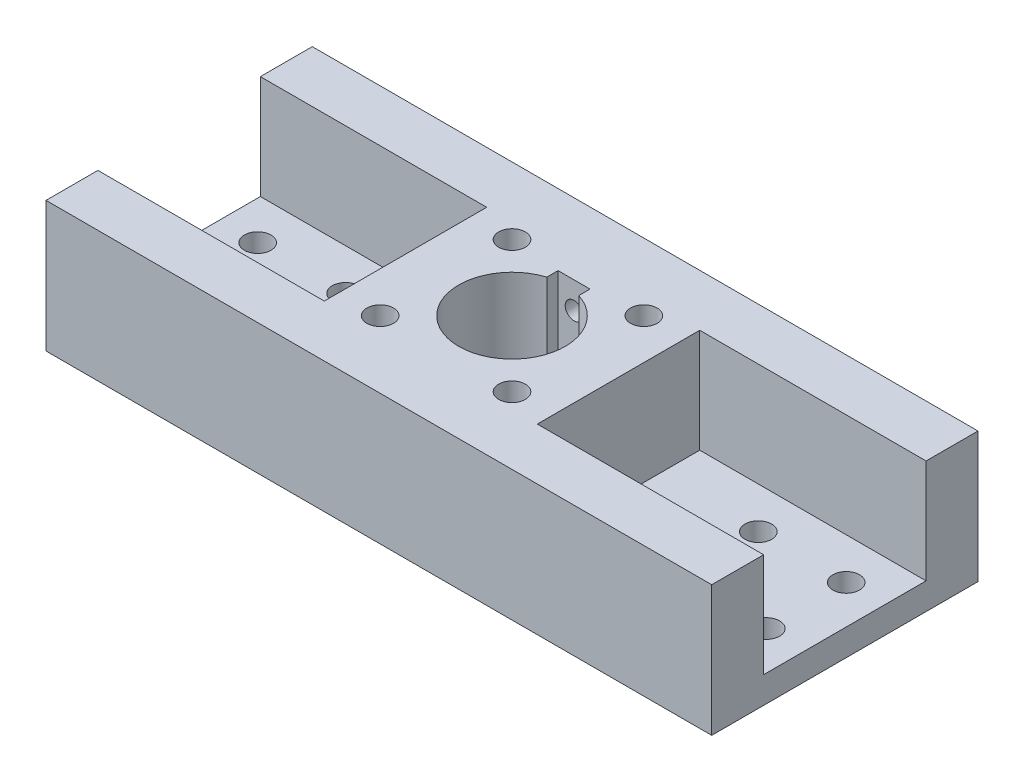
ISO-10303-21;
HEADER;
FILE_DESCRIPTION(('STEP AP214'),'2;1');
FILE_NAME('part.step','',(''),(''),'','','');
FILE_SCHEMA(('AUTOMOTIVE_DESIGN { 1 0 10303 214 1 1 1 1 }'));
ENDSEC;
DATA;
#1=APPLICATION_CONTEXT('core data for automotive mechanical design processes');
#2=APPLICATION_PROTOCOL_DEFINITION('international standard','automotive_design',2000,#1);
#3=PRODUCT_CONTEXT('',#1,'mechanical');
#4=PRODUCT('Part','Part','',(#3));
#5=PRODUCT_RELATED_PRODUCT_CATEGORY('part','',(#4));
#6=PRODUCT_DEFINITION_FORMATION('','',#4);
#7=PRODUCT_DEFINITION_CONTEXT('part definition',#1,'design');
#8=PRODUCT_DEFINITION('design','',#6,#7);
#9=PRODUCT_DEFINITION_SHAPE('','',#8);
#10=(LENGTH_UNIT() NAMED_UNIT(*) SI_UNIT(.MILLI.,.METRE.));
#11=(NAMED_UNIT(*) PLANE_ANGLE_UNIT() SI_UNIT($,.RADIAN.));
#12=(NAMED_UNIT(*) SI_UNIT($,.STERADIAN.) SOLID_ANGLE_UNIT());
#13=UNCERTAINTY_MEASURE_WITH_UNIT(LENGTH_MEASURE(1.E-05),#10,'distance_accuracy_value','');
#14=(GEOMETRIC_REPRESENTATION_CONTEXT(3) GLOBAL_UNCERTAINTY_ASSIGNED_CONTEXT((#13)) GLOBAL_UNIT_ASSIGNED_CONTEXT((#10,
#11,#12)) REPRESENTATION_CONTEXT('',''));
#15=CARTESIAN_POINT('',(0.,0.,0.));
#16=DIRECTION('',(0.,0.,1.));
#17=DIRECTION('',(1.,0.,0.));
#18=AXIS2_PLACEMENT_3D('',#15,#16,#17);
#19=CARTESIAN_POINT('',(0.,-14.5,223.68047062222));
#20=DIRECTION('',(0.,0.,-1.));
#21=DIRECTION('',(-1.,0.,0.));
#22=AXIS2_PLACEMENT_3D('',#19,#20,#21);
#23=CYLINDRICAL_SURFACE('',#22,3.3235);
#24=CARTESIAN_POINT('',(0.,-14.5,-50.));
#25=DIRECTION('',(0.,0.,-1.));
#26=DIRECTION('',(-1.,0.,0.));
#27=AXIS2_PLACEMENT_3D('',#24,#25,#26);
#28=CIRCLE('',#27,3.3235);
#29=CARTESIAN_POINT('',(-3.3235,-14.5,-50.));
#30=VERTEX_POINT('',#29);
#31=EDGE_CURVE('E162',#30,#30,#28,.T.);
#32=ORIENTED_EDGE('',*,*,#31,.T.);
#33=EDGE_LOOP('',(#32));
#34=FACE_BOUND('',#33,.T.);
#35=CARTESIAN_POINT('',(0.,-14.5,-23.3));
#36=DIRECTION('',(0.,0.,-1.));
#37=DIRECTION('',(-1.,0.,0.));
#38=AXIS2_PLACEMENT_3D('',#35,#36,#37);
#39=CIRCLE('',#38,3.3235);
#40=CARTESIAN_POINT('',(-3.3235,-14.5,-23.3));
#41=VERTEX_POINT('',#40);
#42=EDGE_CURVE('E291',#41,#41,#39,.T.);
#43=ORIENTED_EDGE('',*,*,#42,.F.);
#44=EDGE_LOOP('',(#43));
#45=FACE_BOUND('',#44,.T.);
#46=ADVANCED_FACE('F17',(#34,#45),#23,.F.);
#47=CARTESIAN_POINT('',(0.,14.5,223.68047062222));
#48=DIRECTION('',(0.,0.,-1.));
#49=DIRECTION('',(-1.,0.,0.));
#50=AXIS2_PLACEMENT_3D('',#47,#48,#49);
#51=CYLINDRICAL_SURFACE('',#50,3.3235);
#52=CARTESIAN_POINT('',(0.,14.5,-50.));
#53=DIRECTION('',(0.,0.,-1.));
#54=DIRECTION('',(-1.,0.,0.));
#55=AXIS2_PLACEMENT_3D('',#52,#53,#54);
#56=CIRCLE('',#55,3.3235);
#57=CARTESIAN_POINT('',(-3.3235,14.5,-50.));
#58=VERTEX_POINT('',#57);
#59=EDGE_CURVE('E166',#58,#58,#56,.T.);
#60=ORIENTED_EDGE('',*,*,#59,.T.);
#61=EDGE_LOOP('',(#60));
#62=FACE_BOUND('',#61,.T.);
#63=CARTESIAN_POINT('',(0.,14.5,-23.3));
#64=DIRECTION('',(0.,0.,-1.));
#65=DIRECTION('',(-1.,0.,0.));
#66=AXIS2_PLACEMENT_3D('',#63,#64,#65);
#67=CIRCLE('',#66,3.3235);
#68=CARTESIAN_POINT('',(-3.3235,14.5,-23.3));
#69=VERTEX_POINT('',#68);
#70=EDGE_CURVE('E25',#69,#69,#67,.T.);
#71=ORIENTED_EDGE('',*,*,#70,.F.);
#72=EDGE_LOOP('',(#71));
#73=FACE_BOUND('',#72,.T.);
#74=ADVANCED_FACE('F302',(#62,#73),#51,.F.);
#75=CARTESIAN_POINT('',(-6.,-249.18047062222,-23.3));
#76=DIRECTION('',(-1.,0.,0.));
#77=DIRECTION('',(0.,1.,0.));
#78=AXIS2_PLACEMENT_3D('',#75,#76,#77);
#79=PLANE('',#78);
#80=DIRECTION('',(0.,1.,0.));
#81=VECTOR('',#80,1.);
#82=CARTESIAN_POINT('',(-6.,-249.18047062222,-23.3));
#83=LINE('',#82,#81);
#84=CARTESIAN_POINT('',(-6.,-24.5,-23.3));
#85=VERTEX_POINT('',#84);
#86=CARTESIAN_POINT('',(-6.,24.5,-23.3));
#87=VERTEX_POINT('',#86);
#88=EDGE_CURVE('E11',#85,#87,#83,.T.);
#89=ORIENTED_EDGE('',*,*,#88,.T.);
#90=DIRECTION('',(0.,0.,1.));
#91=VECTOR('',#90,1.);
#92=CARTESIAN_POINT('',(-6.,24.5,-23.3));
#93=LINE('',#92,#91);
#94=CARTESIAN_POINT('',(-6.,24.5,-19.0787840283389));
#95=VERTEX_POINT('',#94);
#96=EDGE_CURVE('E540',#87,#95,#93,.T.);
#97=ORIENTED_EDGE('',*,*,#96,.T.);
#98=DIRECTION('',(0.,-1.,0.));
#99=VECTOR('',#98,1.);
#100=CARTESIAN_POINT('',(-6.,-47.5,-19.0787840283389));
#101=LINE('',#100,#99);
#102=CARTESIAN_POINT('',(-6.,-24.5,-19.0787840283389));
#103=VERTEX_POINT('',#102);
#104=EDGE_CURVE('E167',#95,#103,#101,.T.);
#105=ORIENTED_EDGE('',*,*,#104,.T.);
#106=DIRECTION('',(0.,0.,1.));
#107=VECTOR('',#106,1.);
#108=CARTESIAN_POINT('',(-6.,-24.5,0.));
#109=LINE('',#108,#107);
#110=EDGE_CURVE('E236',#85,#103,#109,.T.);
#111=ORIENTED_EDGE('',*,*,#110,.F.);
#112=EDGE_LOOP('',(#89,#97,#105,#111));
#113=FACE_BOUND('',#112,.T.);
#114=ADVANCED_FACE('F304',(#113),#79,.F.);
#115=CARTESIAN_POINT('',(6.,-249.18047062222,-23.3));
#116=DIRECTION('',(0.,0.,-1.));
#117=DIRECTION('',(0.,-1.,0.));
#118=AXIS2_PLACEMENT_3D('',#115,#116,#117);
#119=PLANE('',#118);
#120=DIRECTION('',(0.,1.,0.));
#121=VECTOR('',#120,1.);
#122=CARTESIAN_POINT('',(6.,-249.18047062222,-23.3));
#123=LINE('',#122,#121);
#124=CARTESIAN_POINT('',(6.,-24.5,-23.3));
#125=VERTEX_POINT('',#124);
#126=CARTESIAN_POINT('',(6.,24.5,-23.3));
#127=VERTEX_POINT('',#126);
#128=EDGE_CURVE('E171',#125,#127,#123,.T.);
#129=ORIENTED_EDGE('',*,*,#128,.T.);
#130=DIRECTION('',(-1.,0.,0.));
#131=VECTOR('',#130,1.);
#132=CARTESIAN_POINT('',(6.,24.5,-23.3));
#133=LINE('',#132,#131);
#134=EDGE_CURVE('E460',#127,#87,#133,.T.);
#135=ORIENTED_EDGE('',*,*,#134,.T.);
#136=ORIENTED_EDGE('',*,*,#88,.F.);
#137=DIRECTION('',(-1.,0.,0.));
#138=VECTOR('',#137,1.);
#139=CARTESIAN_POINT('',(0.,-24.5,-23.3));
#140=LINE('',#139,#138);
#141=EDGE_CURVE('E235',#125,#85,#140,.T.);
#142=ORIENTED_EDGE('',*,*,#141,.F.);
#143=EDGE_LOOP('',(#129,#135,#136,#142));
#144=FACE_BOUND('',#143,.T.);
#145=ORIENTED_EDGE('',*,*,#70,.T.);
#146=EDGE_LOOP('',(#145));
#147=FACE_BOUND('',#146,.T.);
#148=ORIENTED_EDGE('',*,*,#42,.T.);
#149=EDGE_LOOP('',(#148));
#150=FACE_BOUND('',#149,.T.);
#151=ADVANCED_FACE('F299',(#144,#147,#150),#119,.F.);
#152=CARTESIAN_POINT('',(6.,-249.18047062222,-18.3));
#153=DIRECTION('',(1.,0.,0.));
#154=DIRECTION('',(0.,1.,0.));
#155=AXIS2_PLACEMENT_3D('',#152,#153,#154);
#156=PLANE('',#155);
#157=DIRECTION('',(0.,1.,0.));
#158=VECTOR('',#157,1.);
#159=CARTESIAN_POINT('',(6.,-47.5,-19.0787840283389));
#160=LINE('',#159,#158);
#161=CARTESIAN_POINT('',(6.,-24.5,-19.0787840283389));
#162=VERTEX_POINT('',#161);
#163=CARTESIAN_POINT('',(6.,24.5,-19.0787840283389));
#164=VERTEX_POINT('',#163);
#165=EDGE_CURVE('E172',#162,#164,#160,.T.);
#166=ORIENTED_EDGE('',*,*,#165,.T.);
#167=DIRECTION('',(0.,0.,-1.));
#168=VECTOR('',#167,1.);
#169=CARTESIAN_POINT('',(6.,24.5,-18.3));
#170=LINE('',#169,#168);
#171=EDGE_CURVE('E530',#164,#127,#170,.T.);
#172=ORIENTED_EDGE('',*,*,#171,.T.);
#173=ORIENTED_EDGE('',*,*,#128,.F.);
#174=DIRECTION('',(0.,0.,-1.));
#175=VECTOR('',#174,1.);
#176=CARTESIAN_POINT('',(6.,-24.5,0.));
#177=LINE('',#176,#175);
#178=EDGE_CURVE('E231',#162,#125,#177,.T.);
#179=ORIENTED_EDGE('',*,*,#178,.F.);
#180=EDGE_LOOP('',(#166,#172,#173,#179));
#181=FACE_BOUND('',#180,.T.);
#182=ADVANCED_FACE('F317',(#181),#156,.F.);
#183=CARTESIAN_POINT('',(-57.5,-144.,0.));
#184=DIRECTION('',(0.,1.,0.));
#185=DIRECTION('',(0.,0.,1.));
#186=AXIS2_PLACEMENT_3D('',#183,#184,#185);
#187=CYLINDRICAL_SURFACE('',#186,5.);
#188=CARTESIAN_POINT('',(-57.5,-24.5,0.));
#189=DIRECTION('',(0.,1.,0.));
#190=DIRECTION('',(0.,0.,1.));
#191=AXIS2_PLACEMENT_3D('',#188,#189,#190);
#192=CIRCLE('',#191,5.);
#193=CARTESIAN_POINT('',(-57.5,-24.5,5.00000000000001));
#194=VERTEX_POINT('',#193);
#195=EDGE_CURVE('E132',#194,#194,#192,.T.);
#196=ORIENTED_EDGE('',*,*,#195,.F.);
#197=EDGE_LOOP('',(#196));
#198=FACE_BOUND('',#197,.T.);
#199=CARTESIAN_POINT('',(-57.5,-14.5,0.));
#200=DIRECTION('',(0.,-1.,0.));
#201=DIRECTION('',(0.,0.,-1.));
#202=AXIS2_PLACEMENT_3D('',#199,#200,#201);
#203=CIRCLE('',#202,5.);
#204=CARTESIAN_POINT('',(-57.5,-14.5,-4.99999999999999));
#205=VERTEX_POINT('',#204);
#206=EDGE_CURVE('E240',#205,#205,#203,.T.);
#207=ORIENTED_EDGE('',*,*,#206,.F.);
#208=EDGE_LOOP('',(#207));
#209=FACE_BOUND('',#208,.T.);
#210=ADVANCED_FACE('F319',(#198,#209),#187,.F.);
#211=CARTESIAN_POINT('',(-77.5,-144.,-15.));
#212=DIRECTION('',(0.,1.,0.));
#213=DIRECTION('',(0.,0.,1.));
#214=AXIS2_PLACEMENT_3D('',#211,#212,#213);
#215=CYLINDRICAL_SURFACE('',#214,5.);
#216=CARTESIAN_POINT('',(-77.5,-24.5,-15.));
#217=DIRECTION('',(0.,1.,0.));
#218=DIRECTION('',(0.,0.,1.));
#219=AXIS2_PLACEMENT_3D('',#216,#217,#218);
#220=CIRCLE('',#219,5.);
#221=CARTESIAN_POINT('',(-77.5,-24.5,-10.));
#222=VERTEX_POINT('',#221);
#223=EDGE_CURVE('E200',#222,#222,#220,.T.);
#224=ORIENTED_EDGE('',*,*,#223,.F.);
#225=EDGE_LOOP('',(#224));
#226=FACE_BOUND('',#225,.T.);
#227=CARTESIAN_POINT('',(-77.5,-14.5,-15.));
#228=DIRECTION('',(0.,-1.,0.));
#229=DIRECTION('',(0.,0.,-1.));
#230=AXIS2_PLACEMENT_3D('',#227,#228,#229);
#231=CIRCLE('',#230,5.);
#232=CARTESIAN_POINT('',(-77.5,-14.5,-20.));
#233=VERTEX_POINT('',#232);
#234=EDGE_CURVE('E250',#233,#233,#231,.T.);
#235=ORIENTED_EDGE('',*,*,#234,.F.);
#236=EDGE_LOOP('',(#235));
#237=FACE_BOUND('',#236,.T.);
#238=ADVANCED_FACE('F322',(#226,#237),#215,.F.);
#239=CARTESIAN_POINT('',(-110.5,-144.,-15.));
#240=DIRECTION('',(0.,1.,0.));
#241=DIRECTION('',(0.,0.,1.));
#242=AXIS2_PLACEMENT_3D('',#239,#240,#241);
#243=CYLINDRICAL_SURFACE('',#242,5.);
#244=CARTESIAN_POINT('',(-110.5,-24.5,-15.));
#245=DIRECTION('',(0.,1.,0.));
#246=DIRECTION('',(0.,0.,1.));
#247=AXIS2_PLACEMENT_3D('',#244,#245,#246);
#248=CIRCLE('',#247,5.);
#249=CARTESIAN_POINT('',(-110.5,-24.5,-10.));
#250=VERTEX_POINT('',#249);
#251=EDGE_CURVE('E204',#250,#250,#248,.T.);
#252=ORIENTED_EDGE('',*,*,#251,.F.);
#253=EDGE_LOOP('',(#252));
#254=FACE_BOUND('',#253,.T.);
#255=CARTESIAN_POINT('',(-110.5,-14.5,-15.));
#256=DIRECTION('',(0.,-1.,0.));
#257=DIRECTION('',(0.,0.,-1.));
#258=AXIS2_PLACEMENT_3D('',#255,#256,#257);
#259=CIRCLE('',#258,5.);
#260=CARTESIAN_POINT('',(-110.5,-14.5,-20.));
#261=VERTEX_POINT('',#260);
#262=EDGE_CURVE('E254',#261,#261,#259,.T.);
#263=ORIENTED_EDGE('',*,*,#262,.F.);
#264=EDGE_LOOP('',(#263));
#265=FACE_BOUND('',#264,.T.);
#266=ADVANCED_FACE('F326',(#254,#265),#243,.F.);
#267=CARTESIAN_POINT('',(-77.5,-144.,15.));
#268=DIRECTION('',(0.,1.,0.));
#269=DIRECTION('',(0.,0.,1.));
#270=AXIS2_PLACEMENT_3D('',#267,#268,#269);
#271=CYLINDRICAL_SURFACE('',#270,5.);
#272=CARTESIAN_POINT('',(-77.5,-24.5,15.));
#273=DIRECTION('',(0.,1.,0.));
#274=DIRECTION('',(0.,0.,1.));
#275=AXIS2_PLACEMENT_3D('',#272,#273,#274);
#276=CIRCLE('',#275,5.);
#277=CARTESIAN_POINT('',(-77.5,-24.5,20.));
#278=VERTEX_POINT('',#277);
#279=EDGE_CURVE('E209',#278,#278,#276,.T.);
#280=ORIENTED_EDGE('',*,*,#279,.F.);
#281=EDGE_LOOP('',(#280));
#282=FACE_BOUND('',#281,.T.);
#283=CARTESIAN_POINT('',(-77.5,-14.5,15.));
#284=DIRECTION('',(0.,-1.,0.));
#285=DIRECTION('',(0.,0.,-1.));
#286=AXIS2_PLACEMENT_3D('',#283,#284,#285);
#287=CIRCLE('',#286,5.);
#288=CARTESIAN_POINT('',(-77.5,-14.5,10.));
#289=VERTEX_POINT('',#288);
#290=EDGE_CURVE('E116',#289,#289,#287,.T.);
#291=ORIENTED_EDGE('',*,*,#290,.F.);
#292=EDGE_LOOP('',(#291));
#293=FACE_BOUND('',#292,.T.);
#294=ADVANCED_FACE('F330',(#282,#293),#271,.F.);
#295=CARTESIAN_POINT('',(-110.5,-144.,15.));
#296=DIRECTION('',(0.,1.,0.));
#297=DIRECTION('',(0.,0.,1.));
#298=AXIS2_PLACEMENT_3D('',#295,#296,#297);
#299=CYLINDRICAL_SURFACE('',#298,5.);
#300=CARTESIAN_POINT('',(-110.5,-24.5,15.));
#301=DIRECTION('',(0.,1.,0.));
#302=DIRECTION('',(0.,0.,1.));
#303=AXIS2_PLACEMENT_3D('',#300,#301,#302);
#304=CIRCLE('',#303,5.);
#305=CARTESIAN_POINT('',(-110.5,-24.5,20.));
#306=VERTEX_POINT('',#305);
#307=EDGE_CURVE('E213',#306,#306,#304,.T.);
#308=ORIENTED_EDGE('',*,*,#307,.F.);
#309=EDGE_LOOP('',(#308));
#310=FACE_BOUND('',#309,.T.);
#311=CARTESIAN_POINT('',(-110.5,-14.5,15.));
#312=DIRECTION('',(0.,-1.,0.));
#313=DIRECTION('',(0.,0.,-1.));
#314=AXIS2_PLACEMENT_3D('',#311,#312,#313);
#315=CIRCLE('',#314,5.);
#316=CARTESIAN_POINT('',(-110.5,-14.5,10.));
#317=VERTEX_POINT('',#316);
#318=EDGE_CURVE('E109',#317,#317,#315,.T.);
#319=ORIENTED_EDGE('',*,*,#318,.F.);
#320=EDGE_LOOP('',(#319));
#321=FACE_BOUND('',#320,.T.);
#322=ADVANCED_FACE('F334',(#310,#321),#299,.F.);
#323=CARTESIAN_POINT('',(77.5,-144.,15.));
#324=DIRECTION('',(0.,1.,0.));
#325=DIRECTION('',(0.,0.,1.));
#326=AXIS2_PLACEMENT_3D('',#323,#324,#325);
#327=CYLINDRICAL_SURFACE('',#326,5.);
#328=CARTESIAN_POINT('',(77.5,-24.5,15.));
#329=DIRECTION('',(0.,1.,0.));
#330=DIRECTION('',(0.,0.,1.));
#331=AXIS2_PLACEMENT_3D('',#328,#329,#330);
#332=CIRCLE('',#331,5.);
#333=CARTESIAN_POINT('',(77.5,-24.5,20.));
#334=VERTEX_POINT('',#333);
#335=EDGE_CURVE('E127',#334,#334,#332,.T.);
#336=ORIENTED_EDGE('',*,*,#335,.F.);
#337=EDGE_LOOP('',(#336));
#338=FACE_BOUND('',#337,.T.);
#339=CARTESIAN_POINT('',(77.5,-14.5,15.));
#340=DIRECTION('',(0.,-1.,0.));
#341=DIRECTION('',(0.,0.,-1.));
#342=AXIS2_PLACEMENT_3D('',#339,#340,#341);
#343=CIRCLE('',#342,5.);
#344=CARTESIAN_POINT('',(77.5,-14.5,10.));
#345=VERTEX_POINT('',#344);
#346=EDGE_CURVE('E177',#345,#345,#343,.T.);
#347=ORIENTED_EDGE('',*,*,#346,.F.);
#348=EDGE_LOOP('',(#347));
#349=FACE_BOUND('',#348,.T.);
#350=ADVANCED_FACE('F338',(#338,#349),#327,.F.);
#351=CARTESIAN_POINT('',(110.5,-144.,15.));
#352=DIRECTION('',(0.,1.,0.));
#353=DIRECTION('',(0.,0.,1.));
#354=AXIS2_PLACEMENT_3D('',#351,#352,#353);
#355=CYLINDRICAL_SURFACE('',#354,5.);
#356=CARTESIAN_POINT('',(110.5,-24.5,15.));
#357=DIRECTION('',(0.,1.,0.));
#358=DIRECTION('',(0.,0.,1.));
#359=AXIS2_PLACEMENT_3D('',#356,#357,#358);
#360=CIRCLE('',#359,5.);
#361=CARTESIAN_POINT('',(110.5,-24.5,20.));
#362=VERTEX_POINT('',#361);
#363=EDGE_CURVE('E131',#362,#362,#360,.T.);
#364=ORIENTED_EDGE('',*,*,#363,.F.);
#365=EDGE_LOOP('',(#364));
#366=FACE_BOUND('',#365,.T.);
#367=CARTESIAN_POINT('',(110.5,-14.5,15.));
#368=DIRECTION('',(0.,-1.,0.));
#369=DIRECTION('',(0.,0.,-1.));
#370=AXIS2_PLACEMENT_3D('',#367,#368,#369);
#371=CIRCLE('',#370,5.);
#372=CARTESIAN_POINT('',(110.5,-14.5,10.));
#373=VERTEX_POINT('',#372);
#374=EDGE_CURVE('E181',#373,#373,#371,.T.);
#375=ORIENTED_EDGE('',*,*,#374,.F.);
#376=EDGE_LOOP('',(#375));
#377=FACE_BOUND('',#376,.T.);
#378=ADVANCED_FACE('F340',(#366,#377),#355,.F.);
#379=CARTESIAN_POINT('',(57.5,-144.,0.));
#380=DIRECTION('',(0.,1.,0.));
#381=DIRECTION('',(0.,0.,1.));
#382=AXIS2_PLACEMENT_3D('',#379,#380,#381);
#383=CYLINDRICAL_SURFACE('',#382,5.);
#384=CARTESIAN_POINT('',(57.5,-24.5,0.));
#385=DIRECTION('',(0.,1.,0.));
#386=DIRECTION('',(0.,0.,1.));
#387=AXIS2_PLACEMENT_3D('',#384,#385,#386);
#388=CIRCLE('',#387,5.);
#389=CARTESIAN_POINT('',(57.5,-24.5,5.00000000000001));
#390=VERTEX_POINT('',#389);
#391=EDGE_CURVE('E195',#390,#390,#388,.T.);
#392=ORIENTED_EDGE('',*,*,#391,.F.);
#393=EDGE_LOOP('',(#392));
#394=FACE_BOUND('',#393,.T.);
#395=CARTESIAN_POINT('',(57.5,-14.5,0.));
#396=DIRECTION('',(0.,-1.,0.));
#397=DIRECTION('',(0.,0.,-1.));
#398=AXIS2_PLACEMENT_3D('',#395,#396,#397);
#399=CIRCLE('',#398,5.);
#400=CARTESIAN_POINT('',(57.5,-14.5,-4.99999999999999));
#401=VERTEX_POINT('',#400);
#402=EDGE_CURVE('E268',#401,#401,#399,.T.);
#403=ORIENTED_EDGE('',*,*,#402,.F.);
#404=EDGE_LOOP('',(#403));
#405=FACE_BOUND('',#404,.T.);
#406=ADVANCED_FACE('F343',(#394,#405),#383,.F.);
#407=CARTESIAN_POINT('',(110.5,-144.,-15.));
#408=DIRECTION('',(0.,1.,0.));
#409=DIRECTION('',(0.,0.,1.));
#410=AXIS2_PLACEMENT_3D('',#407,#408,#409);
#411=CYLINDRICAL_SURFACE('',#410,5.);
#412=CARTESIAN_POINT('',(110.5,-24.5,-15.));
#413=DIRECTION('',(0.,1.,0.));
#414=DIRECTION('',(0.,0.,1.));
#415=AXIS2_PLACEMENT_3D('',#412,#413,#414);
#416=CIRCLE('',#415,5.);
#417=CARTESIAN_POINT('',(110.5,-24.5,-10.));
#418=VERTEX_POINT('',#417);
#419=EDGE_CURVE('E199',#418,#418,#416,.T.);
#420=ORIENTED_EDGE('',*,*,#419,.F.);
#421=EDGE_LOOP('',(#420));
#422=FACE_BOUND('',#421,.T.);
#423=CARTESIAN_POINT('',(110.5,-14.5,-15.));
#424=DIRECTION('',(0.,-1.,0.));
#425=DIRECTION('',(0.,0.,-1.));
#426=AXIS2_PLACEMENT_3D('',#423,#424,#425);
#427=CIRCLE('',#426,5.);
#428=CARTESIAN_POINT('',(110.5,-14.5,-20.));
#429=VERTEX_POINT('',#428);
#430=EDGE_CURVE('E246',#429,#429,#427,.T.);
#431=ORIENTED_EDGE('',*,*,#430,.F.);
#432=EDGE_LOOP('',(#431));
#433=FACE_BOUND('',#432,.T.);
#434=ADVANCED_FACE('F347',(#422,#433),#411,.F.);
#435=CARTESIAN_POINT('',(77.5,-144.,-15.));
#436=DIRECTION('',(0.,1.,0.));
#437=DIRECTION('',(0.,0.,1.));
#438=AXIS2_PLACEMENT_3D('',#435,#436,#437);
#439=CYLINDRICAL_SURFACE('',#438,5.);
#440=CARTESIAN_POINT('',(77.5,-24.5,-15.));
#441=DIRECTION('',(0.,1.,0.));
#442=DIRECTION('',(0.,0.,1.));
#443=AXIS2_PLACEMENT_3D('',#440,#441,#442);
#444=CIRCLE('',#443,5.);
#445=CARTESIAN_POINT('',(77.5,-24.5,-10.));
#446=VERTEX_POINT('',#445);
#447=EDGE_CURVE('E205',#446,#446,#444,.T.);
#448=ORIENTED_EDGE('',*,*,#447,.F.);
#449=EDGE_LOOP('',(#448));
#450=FACE_BOUND('',#449,.T.);
#451=CARTESIAN_POINT('',(77.5,-14.5,-15.));
#452=DIRECTION('',(0.,-1.,0.));
#453=DIRECTION('',(0.,0.,-1.));
#454=AXIS2_PLACEMENT_3D('',#451,#452,#453);
#455=CIRCLE('',#454,5.);
#456=CARTESIAN_POINT('',(77.5,-14.5,-20.));
#457=VERTEX_POINT('',#456);
#458=EDGE_CURVE('E241',#457,#457,#455,.T.);
#459=ORIENTED_EDGE('',*,*,#458,.F.);
#460=EDGE_LOOP('',(#459));
#461=FACE_BOUND('',#460,.T.);
#462=ADVANCED_FACE('F351',(#450,#461),#439,.F.);
#463=CARTESIAN_POINT('',(-24.7487373415292,-47.5,-24.7487373415292));
#464=DIRECTION('',(0.,1.,0.));
#465=DIRECTION('',(0.,0.,1.));
#466=AXIS2_PLACEMENT_3D('',#463,#464,#465);
#467=CYLINDRICAL_SURFACE('',#466,5.);
#468=CARTESIAN_POINT('',(-24.7487373415292,-24.5,-24.7487373415292));
#469=DIRECTION('',(0.,-1.,0.));
#470=DIRECTION('',(0.,0.,1.));
#471=AXIS2_PLACEMENT_3D('',#468,#469,#470);
#472=CIRCLE('',#471,5.);
#473=CARTESIAN_POINT('',(-24.7487373415292,-24.5,-19.7487373415292));
#474=VERTEX_POINT('',#473);
#475=EDGE_CURVE('E217',#474,#474,#472,.T.);
#476=ORIENTED_EDGE('',*,*,#475,.T.);
#477=EDGE_LOOP('',(#476));
#478=FACE_BOUND('',#477,.T.);
#479=CARTESIAN_POINT('',(-24.7487373415292,24.5,-24.7487373415292));
#480=DIRECTION('',(0.,-1.,0.));
#481=DIRECTION('',(1.,0.,0.));
#482=AXIS2_PLACEMENT_3D('',#479,#480,#481);
#483=CIRCLE('',#482,5.);
#484=CARTESIAN_POINT('',(-19.7487373415292,24.5,-24.7487373415292));
#485=VERTEX_POINT('',#484);
#486=EDGE_CURVE('E470',#485,#485,#483,.T.);
#487=ORIENTED_EDGE('',*,*,#486,.F.);
#488=EDGE_LOOP('',(#487));
#489=FACE_BOUND('',#488,.T.);
#490=ADVANCED_FACE('F355',(#478,#489),#467,.F.);
#491=CARTESIAN_POINT('',(-24.7487373415292,-47.5,24.7487373415292));
#492=DIRECTION('',(0.,1.,0.));
#493=DIRECTION('',(0.,0.,1.));
#494=AXIS2_PLACEMENT_3D('',#491,#492,#493);
#495=CYLINDRICAL_SURFACE('',#494,5.);
#496=CARTESIAN_POINT('',(-24.7487373415292,-24.5,24.7487373415292));
#497=DIRECTION('',(0.,-1.,0.));
#498=DIRECTION('',(0.,0.,1.));
#499=AXIS2_PLACEMENT_3D('',#496,#497,#498);
#500=CIRCLE('',#499,5.);
#501=CARTESIAN_POINT('',(-24.7487373415292,-24.5,29.7487373415292));
#502=VERTEX_POINT('',#501);
#503=EDGE_CURVE('E221',#502,#502,#500,.T.);
#504=ORIENTED_EDGE('',*,*,#503,.T.);
#505=EDGE_LOOP('',(#504));
#506=FACE_BOUND('',#505,.T.);
#507=CARTESIAN_POINT('',(-24.7487373415292,24.5,24.7487373415292));
#508=DIRECTION('',(0.,-1.,0.));
#509=DIRECTION('',(1.,0.,0.));
#510=AXIS2_PLACEMENT_3D('',#507,#508,#509);
#511=CIRCLE('',#510,5.);
#512=CARTESIAN_POINT('',(-19.7487373415292,24.5,24.7487373415292));
#513=VERTEX_POINT('',#512);
#514=EDGE_CURVE('E120',#513,#513,#511,.T.);
#515=ORIENTED_EDGE('',*,*,#514,.F.);
#516=EDGE_LOOP('',(#515));
#517=FACE_BOUND('',#516,.T.);
#518=ADVANCED_FACE('F362',(#506,#517),#495,.F.);
#519=CARTESIAN_POINT('',(24.7487373415292,-47.5,24.7487373415292));
#520=DIRECTION('',(0.,1.,0.));
#521=DIRECTION('',(0.,0.,1.));
#522=AXIS2_PLACEMENT_3D('',#519,#520,#521);
#523=CYLINDRICAL_SURFACE('',#522,5.);
#524=CARTESIAN_POINT('',(24.7487373415292,-24.5,24.7487373415292));
#525=DIRECTION('',(0.,-1.,0.));
#526=DIRECTION('',(0.,0.,1.));
#527=AXIS2_PLACEMENT_3D('',#524,#525,#526);
#528=CIRCLE('',#527,5.);
#529=CARTESIAN_POINT('',(24.7487373415292,-24.5,29.7487373415292));
#530=VERTEX_POINT('',#529);
#531=EDGE_CURVE('E158',#530,#530,#528,.T.);
#532=ORIENTED_EDGE('',*,*,#531,.T.);
#533=EDGE_LOOP('',(#532));
#534=FACE_BOUND('',#533,.T.);
#535=CARTESIAN_POINT('',(24.7487373415292,24.5,24.7487373415292));
#536=DIRECTION('',(0.,-1.,0.));
#537=DIRECTION('',(1.,0.,0.));
#538=AXIS2_PLACEMENT_3D('',#535,#536,#537);
#539=CIRCLE('',#538,5.);
#540=CARTESIAN_POINT('',(29.7487373415292,24.5,24.7487373415292));
#541=VERTEX_POINT('',#540);
#542=EDGE_CURVE('E126',#541,#541,#539,.T.);
#543=ORIENTED_EDGE('',*,*,#542,.F.);
#544=EDGE_LOOP('',(#543));
#545=FACE_BOUND('',#544,.T.);
#546=ADVANCED_FACE('F366',(#534,#545),#523,.F.);
#547=CARTESIAN_POINT('',(24.7487373415292,-47.5,-24.7487373415292));
#548=DIRECTION('',(0.,1.,0.));
#549=DIRECTION('',(0.,0.,1.));
#550=AXIS2_PLACEMENT_3D('',#547,#548,#549);
#551=CYLINDRICAL_SURFACE('',#550,5.);
#552=CARTESIAN_POINT('',(24.7487373415292,-24.5,-24.7487373415292));
#553=DIRECTION('',(0.,-1.,0.));
#554=DIRECTION('',(0.,0.,1.));
#555=AXIS2_PLACEMENT_3D('',#552,#553,#554);
#556=CIRCLE('',#555,5.);
#557=CARTESIAN_POINT('',(24.7487373415292,-24.5,-19.7487373415292));
#558=VERTEX_POINT('',#557);
#559=EDGE_CURVE('E153',#558,#558,#556,.T.);
#560=ORIENTED_EDGE('',*,*,#559,.T.);
#561=EDGE_LOOP('',(#560));
#562=FACE_BOUND('',#561,.T.);
#563=CARTESIAN_POINT('',(24.7487373415292,24.5,-24.7487373415292));
#564=DIRECTION('',(0.,-1.,0.));
#565=DIRECTION('',(1.,0.,0.));
#566=AXIS2_PLACEMENT_3D('',#563,#564,#565);
#567=CIRCLE('',#566,5.);
#568=CARTESIAN_POINT('',(29.7487373415292,24.5,-24.7487373415292));
#569=VERTEX_POINT('',#568);
#570=EDGE_CURVE('E122',#569,#569,#567,.T.);
#571=ORIENTED_EDGE('',*,*,#570,.F.);
#572=EDGE_LOOP('',(#571));
#573=FACE_BOUND('',#572,.T.);
#574=ADVANCED_FACE('F370',(#562,#573),#551,.F.);
#575=CARTESIAN_POINT('',(0.,-47.5,0.));
#576=DIRECTION('',(0.,1.,0.));
#577=DIRECTION('',(0.,0.,1.));
#578=AXIS2_PLACEMENT_3D('',#575,#576,#577);
#579=CYLINDRICAL_SURFACE('',#578,20.);
#580=ORIENTED_EDGE('',*,*,#165,.F.);
#581=CARTESIAN_POINT('',(0.,-24.5,0.));
#582=DIRECTION('',(0.,-1.,0.));
#583=DIRECTION('',(0.,0.,1.));
#584=AXIS2_PLACEMENT_3D('',#581,#582,#583);
#585=CIRCLE('',#584,20.);
#586=EDGE_CURVE('E157',#162,#103,#585,.T.);
#587=ORIENTED_EDGE('',*,*,#586,.T.);
#588=ORIENTED_EDGE('',*,*,#104,.F.);
#589=CARTESIAN_POINT('',(0.,24.5,0.));
#590=DIRECTION('',(0.,-1.,0.));
#591=DIRECTION('',(1.,0.,0.));
#592=AXIS2_PLACEMENT_3D('',#589,#590,#591);
#593=CIRCLE('',#592,20.);
#594=EDGE_CURVE('E537',#164,#95,#593,.T.);
#595=ORIENTED_EDGE('',*,*,#594,.F.);
#596=EDGE_LOOP('',(#580,#587,#588,#595));
#597=FACE_BOUND('',#596,.T.);
#598=ADVANCED_FACE('F383',(#597),#579,.F.);
#599=CARTESIAN_POINT('',(40.,-14.5,-30.5));
#600=DIRECTION('',(0.,0.,1.));
#601=DIRECTION('',(1.,0.,0.));
#602=AXIS2_PLACEMENT_3D('',#599,#600,#601);
#603=PLANE('',#602);
#604=DIRECTION('',(1.,0.,0.));
#605=VECTOR('',#604,1.);
#606=CARTESIAN_POINT('',(40.,24.5,-30.5));
#607=LINE('',#606,#605);
#608=CARTESIAN_POINT('',(40.,24.5,-30.5));
#609=VERTEX_POINT('',#608);
#610=CARTESIAN_POINT('',(125.,24.5,-30.5));
#611=VERTEX_POINT('',#610);
#612=EDGE_CURVE('E136',#609,#611,#607,.T.);
#613=ORIENTED_EDGE('',*,*,#612,.F.);
#614=DIRECTION('',(0.,1.,0.));
#615=VECTOR('',#614,1.);
#616=CARTESIAN_POINT('',(40.,-14.5,-30.5));
#617=LINE('',#616,#615);
#618=CARTESIAN_POINT('',(40.,-14.5,-30.5));
#619=VERTEX_POINT('',#618);
#620=EDGE_CURVE('E50',#619,#609,#617,.T.);
#621=ORIENTED_EDGE('',*,*,#620,.F.);
#622=DIRECTION('',(1.,0.,0.));
#623=VECTOR('',#622,1.);
#624=CARTESIAN_POINT('',(40.,-14.5,-30.5));
#625=LINE('',#624,#623);
#626=CARTESIAN_POINT('',(125.,-14.5,-30.5));
#627=VERTEX_POINT('',#626);
#628=EDGE_CURVE('E245',#619,#627,#625,.T.);
#629=ORIENTED_EDGE('',*,*,#628,.T.);
#630=DIRECTION('',(0.,1.,0.));
#631=VECTOR('',#630,1.);
#632=CARTESIAN_POINT('',(125.,-14.5,-30.5));
#633=LINE('',#632,#631);
#634=EDGE_CURVE('E445',#627,#611,#633,.T.);
#635=ORIENTED_EDGE('',*,*,#634,.T.);
#636=EDGE_LOOP('',(#613,#621,#629,#635));
#637=FACE_BOUND('',#636,.T.);
#638=ADVANCED_FACE('F376',(#637),#603,.T.);
#639=CARTESIAN_POINT('',(40.,-14.5,30.5));
#640=DIRECTION('',(1.,0.,0.));
#641=DIRECTION('',(0.,1.,0.));
#642=AXIS2_PLACEMENT_3D('',#639,#640,#641);
#643=PLANE('',#642);
#644=DIRECTION('',(0.,0.,-1.));
#645=VECTOR('',#644,1.);
#646=CARTESIAN_POINT('',(40.,24.5,30.5));
#647=LINE('',#646,#645);
#648=CARTESIAN_POINT('',(40.,24.5,30.5));
#649=VERTEX_POINT('',#648);
#650=EDGE_CURVE('E125',#649,#609,#647,.T.);
#651=ORIENTED_EDGE('',*,*,#650,.F.);
#652=DIRECTION('',(0.,1.,0.));
#653=VECTOR('',#652,1.);
#654=CARTESIAN_POINT('',(40.,-14.5,30.5));
#655=LINE('',#654,#653);
#656=CARTESIAN_POINT('',(40.,-14.5,30.5));
#657=VERTEX_POINT('',#656);
#658=EDGE_CURVE('E37',#657,#649,#655,.T.);
#659=ORIENTED_EDGE('',*,*,#658,.F.);
#660=DIRECTION('',(0.,0.,-1.));
#661=VECTOR('',#660,1.);
#662=CARTESIAN_POINT('',(40.,-14.5,30.5));
#663=LINE('',#662,#661);
#664=EDGE_CURVE('E280',#657,#619,#663,.T.);
#665=ORIENTED_EDGE('',*,*,#664,.T.);
#666=ORIENTED_EDGE('',*,*,#620,.T.);
#667=EDGE_LOOP('',(#651,#659,#665,#666));
#668=FACE_BOUND('',#667,.T.);
#669=ADVANCED_FACE('F372',(#668),#643,.T.);
#670=CARTESIAN_POINT('',(125.,-14.5,30.5));
#671=DIRECTION('',(0.,0.,-1.));
#672=DIRECTION('',(0.,-1.,0.));
#673=AXIS2_PLACEMENT_3D('',#670,#671,#672);
#674=PLANE('',#673);
#675=DIRECTION('',(-1.,0.,0.));
#676=VECTOR('',#675,1.);
#677=CARTESIAN_POINT('',(125.,24.5,30.5));
#678=LINE('',#677,#676);
#679=CARTESIAN_POINT('',(125.,24.5,30.5));
#680=VERTEX_POINT('',#679);
#681=EDGE_CURVE('E151',#680,#649,#678,.T.);
#682=ORIENTED_EDGE('',*,*,#681,.F.);
#683=DIRECTION('',(0.,1.,0.));
#684=VECTOR('',#683,1.);
#685=CARTESIAN_POINT('',(125.,-14.5,30.5));
#686=LINE('',#685,#684);
#687=CARTESIAN_POINT('',(125.,-14.5,30.5));
#688=VERTEX_POINT('',#687);
#689=EDGE_CURVE('E441',#688,#680,#686,.T.);
#690=ORIENTED_EDGE('',*,*,#689,.F.);
#691=DIRECTION('',(-1.,0.,0.));
#692=VECTOR('',#691,1.);
#693=CARTESIAN_POINT('',(125.,-14.5,30.5));
#694=LINE('',#693,#692);
#695=EDGE_CURVE('E271',#688,#657,#694,.T.);
#696=ORIENTED_EDGE('',*,*,#695,.T.);
#697=ORIENTED_EDGE('',*,*,#658,.T.);
#698=EDGE_LOOP('',(#682,#690,#696,#697));
#699=FACE_BOUND('',#698,.T.);
#700=ADVANCED_FACE('F375',(#699),#674,.T.);
#701=CARTESIAN_POINT('',(0.,-14.5,0.));
#702=DIRECTION('',(0.,-1.,0.));
#703=DIRECTION('',(0.,0.,-1.));
#704=AXIS2_PLACEMENT_3D('',#701,#702,#703);
#705=PLANE('',#704);
#706=DIRECTION('',(0.,0.,1.));
#707=VECTOR('',#706,1.);
#708=CARTESIAN_POINT('',(125.,-14.5,-30.5));
#709=LINE('',#708,#707);
#710=EDGE_CURVE('E437',#627,#688,#709,.T.);
#711=ORIENTED_EDGE('',*,*,#710,.F.);
#712=ORIENTED_EDGE('',*,*,#628,.F.);
#713=ORIENTED_EDGE('',*,*,#664,.F.);
#714=ORIENTED_EDGE('',*,*,#695,.F.);
#715=EDGE_LOOP('',(#711,#712,#713,#714));
#716=FACE_BOUND('',#715,.T.);
#717=ORIENTED_EDGE('',*,*,#458,.T.);
#718=EDGE_LOOP('',(#717));
#719=FACE_BOUND('',#718,.T.);
#720=ORIENTED_EDGE('',*,*,#430,.T.);
#721=EDGE_LOOP('',(#720));
#722=FACE_BOUND('',#721,.T.);
#723=ORIENTED_EDGE('',*,*,#402,.T.);
#724=EDGE_LOOP('',(#723));
#725=FACE_BOUND('',#724,.T.);
#726=ORIENTED_EDGE('',*,*,#374,.T.);
#727=EDGE_LOOP('',(#726));
#728=FACE_BOUND('',#727,.T.);
#729=ORIENTED_EDGE('',*,*,#346,.T.);
#730=EDGE_LOOP('',(#729));
#731=FACE_BOUND('',#730,.T.);
#732=ADVANCED_FACE('F377',(#716,#719,#722,#725,#728,#731),#705,.F.);
#733=CARTESIAN_POINT('',(-125.,-14.5,-30.5));
#734=DIRECTION('',(0.,0.,1.));
#735=DIRECTION('',(1.,0.,0.));
#736=AXIS2_PLACEMENT_3D('',#733,#734,#735);
#737=PLANE('',#736);
#738=DIRECTION('',(1.,0.,0.));
#739=VECTOR('',#738,1.);
#740=CARTESIAN_POINT('',(-125.,24.5,-30.5));
#741=LINE('',#740,#739);
#742=CARTESIAN_POINT('',(-125.,24.5,-30.5));
#743=VERTEX_POINT('',#742);
#744=CARTESIAN_POINT('',(-40.,24.5,-30.5));
#745=VERTEX_POINT('',#744);
#746=EDGE_CURVE('E144',#743,#745,#741,.T.);
#747=ORIENTED_EDGE('',*,*,#746,.F.);
#748=DIRECTION('',(0.,1.,0.));
#749=VECTOR('',#748,1.);
#750=CARTESIAN_POINT('',(-125.,-14.5,-30.5));
#751=LINE('',#750,#749);
#752=CARTESIAN_POINT('',(-125.,-14.5,-30.5));
#753=VERTEX_POINT('',#752);
#754=EDGE_CURVE('E98',#753,#743,#751,.T.);
#755=ORIENTED_EDGE('',*,*,#754,.F.);
#756=DIRECTION('',(1.,0.,0.));
#757=VECTOR('',#756,1.);
#758=CARTESIAN_POINT('',(-125.,-14.5,-30.5));
#759=LINE('',#758,#757);
#760=CARTESIAN_POINT('',(-40.,-14.5,-30.5));
#761=VERTEX_POINT('',#760);
#762=EDGE_CURVE('E94',#753,#761,#759,.T.);
#763=ORIENTED_EDGE('',*,*,#762,.T.);
#764=DIRECTION('',(0.,1.,0.));
#765=VECTOR('',#764,1.);
#766=CARTESIAN_POINT('',(-40.,-14.5,-30.5));
#767=LINE('',#766,#765);
#768=EDGE_CURVE('E76',#761,#745,#767,.T.);
#769=ORIENTED_EDGE('',*,*,#768,.T.);
#770=EDGE_LOOP('',(#747,#755,#763,#769));
#771=FACE_BOUND('',#770,.T.);
#772=ADVANCED_FACE('F95',(#771),#737,.T.);
#773=CARTESIAN_POINT('',(-40.,-14.5,30.5));
#774=DIRECTION('',(0.,0.,-1.));
#775=DIRECTION('',(-1.,0.,0.));
#776=AXIS2_PLACEMENT_3D('',#773,#774,#775);
#777=PLANE('',#776);
#778=DIRECTION('',(-1.,0.,0.));
#779=VECTOR('',#778,1.);
#780=CARTESIAN_POINT('',(-40.,24.5,30.5));
#781=LINE('',#780,#779);
#782=CARTESIAN_POINT('',(-40.,24.5,30.5));
#783=VERTEX_POINT('',#782);
#784=CARTESIAN_POINT('',(-125.,24.5,30.5));
#785=VERTEX_POINT('',#784);
#786=EDGE_CURVE('E152',#783,#785,#781,.T.);
#787=ORIENTED_EDGE('',*,*,#786,.F.);
#788=DIRECTION('',(0.,1.,0.));
#789=VECTOR('',#788,1.);
#790=CARTESIAN_POINT('',(-40.,-14.5,30.5));
#791=LINE('',#790,#789);
#792=CARTESIAN_POINT('',(-40.,-14.5,30.5));
#793=VERTEX_POINT('',#792);
#794=EDGE_CURVE('E89',#793,#783,#791,.T.);
#795=ORIENTED_EDGE('',*,*,#794,.F.);
#796=DIRECTION('',(-1.,0.,0.));
#797=VECTOR('',#796,1.);
#798=CARTESIAN_POINT('',(-40.,-14.5,30.5));
#799=LINE('',#798,#797);
#800=CARTESIAN_POINT('',(-125.,-14.5,30.5));
#801=VERTEX_POINT('',#800);
#802=EDGE_CURVE('E90',#793,#801,#799,.T.);
#803=ORIENTED_EDGE('',*,*,#802,.T.);
#804=DIRECTION('',(0.,1.,0.));
#805=VECTOR('',#804,1.);
#806=CARTESIAN_POINT('',(-125.,-14.5,30.5));
#807=LINE('',#806,#805);
#808=EDGE_CURVE('E469',#801,#785,#807,.T.);
#809=ORIENTED_EDGE('',*,*,#808,.T.);
#810=EDGE_LOOP('',(#787,#795,#803,#809));
#811=FACE_BOUND('',#810,.T.);
#812=ADVANCED_FACE('F387',(#811),#777,.T.);
#813=CARTESIAN_POINT('',(-40.,-14.5,-30.5));
#814=DIRECTION('',(-1.,0.,0.));
#815=DIRECTION('',(0.,0.,1.));
#816=AXIS2_PLACEMENT_3D('',#813,#814,#815);
#817=PLANE('',#816);
#818=DIRECTION('',(0.,0.,1.));
#819=VECTOR('',#818,1.);
#820=CARTESIAN_POINT('',(-40.,24.5,-30.5));
#821=LINE('',#820,#819);
#822=EDGE_CURVE('E84',#745,#783,#821,.T.);
#823=ORIENTED_EDGE('',*,*,#822,.F.);
#824=ORIENTED_EDGE('',*,*,#768,.F.);
#825=DIRECTION('',(0.,0.,1.));
#826=VECTOR('',#825,1.);
#827=CARTESIAN_POINT('',(-40.,-14.5,-30.5));
#828=LINE('',#827,#826);
#829=EDGE_CURVE('E81',#761,#793,#828,.T.);
#830=ORIENTED_EDGE('',*,*,#829,.T.);
#831=ORIENTED_EDGE('',*,*,#794,.T.);
#832=EDGE_LOOP('',(#823,#824,#830,#831));
#833=FACE_BOUND('',#832,.T.);
#834=ADVANCED_FACE('F78',(#833),#817,.T.);
#835=CARTESIAN_POINT('',(0.,-14.5,0.));
#836=DIRECTION('',(0.,-1.,0.));
#837=DIRECTION('',(0.,0.,-1.));
#838=AXIS2_PLACEMENT_3D('',#835,#836,#837);
#839=PLANE('',#838);
#840=ORIENTED_EDGE('',*,*,#829,.F.);
#841=ORIENTED_EDGE('',*,*,#762,.F.);
#842=DIRECTION('',(0.,0.,-1.));
#843=VECTOR('',#842,1.);
#844=CARTESIAN_POINT('',(-125.,-14.5,30.5));
#845=LINE('',#844,#843);
#846=EDGE_CURVE('E517',#801,#753,#845,.T.);
#847=ORIENTED_EDGE('',*,*,#846,.F.);
#848=ORIENTED_EDGE('',*,*,#802,.F.);
#849=EDGE_LOOP('',(#840,#841,#847,#848));
#850=FACE_BOUND('',#849,.T.);
#851=ORIENTED_EDGE('',*,*,#318,.T.);
#852=EDGE_LOOP('',(#851));
#853=FACE_BOUND('',#852,.T.);
#854=ORIENTED_EDGE('',*,*,#290,.T.);
#855=EDGE_LOOP('',(#854));
#856=FACE_BOUND('',#855,.T.);
#857=ORIENTED_EDGE('',*,*,#262,.T.);
#858=EDGE_LOOP('',(#857));
#859=FACE_BOUND('',#858,.T.);
#860=ORIENTED_EDGE('',*,*,#234,.T.);
#861=EDGE_LOOP('',(#860));
#862=FACE_BOUND('',#861,.T.);
#863=ORIENTED_EDGE('',*,*,#206,.T.);
#864=EDGE_LOOP('',(#863));
#865=FACE_BOUND('',#864,.T.);
#866=ADVANCED_FACE('F105',(#850,#853,#856,#859,#862,#865),#839,.F.);
#867=CARTESIAN_POINT('',(0.,-24.5,0.));
#868=DIRECTION('',(0.,1.,0.));
#869=DIRECTION('',(1.,0.,0.));
#870=AXIS2_PLACEMENT_3D('',#867,#868,#869);
#871=PLANE('',#870);
#872=DIRECTION('',(0.,0.,-1.));
#873=VECTOR('',#872,1.);
#874=CARTESIAN_POINT('',(125.,-24.5,50.));
#875=LINE('',#874,#873);
#876=CARTESIAN_POINT('',(125.,-24.5,50.));
#877=VERTEX_POINT('',#876);
#878=CARTESIAN_POINT('',(125.,-24.5,-50.));
#879=VERTEX_POINT('',#878);
#880=EDGE_CURVE('E489',#877,#879,#875,.T.);
#881=ORIENTED_EDGE('',*,*,#880,.F.);
#882=DIRECTION('',(1.,0.,0.));
#883=VECTOR('',#882,1.);
#884=CARTESIAN_POINT('',(-125.,-24.5,50.));
#885=LINE('',#884,#883);
#886=CARTESIAN_POINT('',(-125.,-24.5,50.));
#887=VERTEX_POINT('',#886);
#888=EDGE_CURVE('E185',#887,#877,#885,.T.);
#889=ORIENTED_EDGE('',*,*,#888,.F.);
#890=DIRECTION('',(0.,0.,1.));
#891=VECTOR('',#890,1.);
#892=CARTESIAN_POINT('',(-125.,-24.5,-50.));
#893=LINE('',#892,#891);
#894=CARTESIAN_POINT('',(-125.,-24.5,-50.));
#895=VERTEX_POINT('',#894);
#896=EDGE_CURVE('E465',#895,#887,#893,.T.);
#897=ORIENTED_EDGE('',*,*,#896,.F.);
#898=DIRECTION('',(-1.,0.,0.));
#899=VECTOR('',#898,1.);
#900=CARTESIAN_POINT('',(125.,-24.5,-50.));
#901=LINE('',#900,#899);
#902=EDGE_CURVE('E176',#879,#895,#901,.T.);
#903=ORIENTED_EDGE('',*,*,#902,.F.);
#904=EDGE_LOOP('',(#881,#889,#897,#903));
#905=FACE_BOUND('',#904,.T.);
#906=ORIENTED_EDGE('',*,*,#586,.F.);
#907=ORIENTED_EDGE('',*,*,#178,.T.);
#908=ORIENTED_EDGE('',*,*,#141,.T.);
#909=ORIENTED_EDGE('',*,*,#110,.T.);
#910=EDGE_LOOP('',(#906,#907,#908,#909));
#911=FACE_BOUND('',#910,.T.);
#912=ORIENTED_EDGE('',*,*,#559,.F.);
#913=EDGE_LOOP('',(#912));
#914=FACE_BOUND('',#913,.T.);
#915=ORIENTED_EDGE('',*,*,#531,.F.);
#916=EDGE_LOOP('',(#915));
#917=FACE_BOUND('',#916,.T.);
#918=ORIENTED_EDGE('',*,*,#503,.F.);
#919=EDGE_LOOP('',(#918));
#920=FACE_BOUND('',#919,.T.);
#921=ORIENTED_EDGE('',*,*,#475,.F.);
#922=EDGE_LOOP('',(#921));
#923=FACE_BOUND('',#922,.T.);
#924=ORIENTED_EDGE('',*,*,#307,.T.);
#925=EDGE_LOOP('',(#924));
#926=FACE_BOUND('',#925,.T.);
#927=ORIENTED_EDGE('',*,*,#279,.T.);
#928=EDGE_LOOP('',(#927));
#929=FACE_BOUND('',#928,.T.);
#930=ORIENTED_EDGE('',*,*,#251,.T.);
#931=EDGE_LOOP('',(#930));
#932=FACE_BOUND('',#931,.T.);
#933=ORIENTED_EDGE('',*,*,#223,.T.);
#934=EDGE_LOOP('',(#933));
#935=FACE_BOUND('',#934,.T.);
#936=ORIENTED_EDGE('',*,*,#447,.T.);
#937=EDGE_LOOP('',(#936));
#938=FACE_BOUND('',#937,.T.);
#939=ORIENTED_EDGE('',*,*,#419,.T.);
#940=EDGE_LOOP('',(#939));
#941=FACE_BOUND('',#940,.T.);
#942=ORIENTED_EDGE('',*,*,#391,.T.);
#943=EDGE_LOOP('',(#942));
#944=FACE_BOUND('',#943,.T.);
#945=ORIENTED_EDGE('',*,*,#363,.T.);
#946=EDGE_LOOP('',(#945));
#947=FACE_BOUND('',#946,.T.);
#948=ORIENTED_EDGE('',*,*,#335,.T.);
#949=EDGE_LOOP('',(#948));
#950=FACE_BOUND('',#949,.T.);
#951=ORIENTED_EDGE('',*,*,#195,.T.);
#952=EDGE_LOOP('',(#951));
#953=FACE_BOUND('',#952,.T.);
#954=ADVANCED_FACE('F396',(#905,#911,#914,#917,#920,#923,#926,#929,#932,#935,#938,#941,#944,
#947,#950,#953),#871,.F.);
#955=CARTESIAN_POINT('',(-125.,-24.5,50.));
#956=DIRECTION('',(0.,0.,1.));
#957=DIRECTION('',(1.,0.,0.));
#958=AXIS2_PLACEMENT_3D('',#955,#956,#957);
#959=PLANE('',#958);
#960=DIRECTION('',(1.,0.,0.));
#961=VECTOR('',#960,1.);
#962=CARTESIAN_POINT('',(-125.,24.5,50.));
#963=LINE('',#962,#961);
#964=CARTESIAN_POINT('',(-125.,24.5,50.));
#965=VERTEX_POINT('',#964);
#966=CARTESIAN_POINT('',(125.,24.5,50.));
#967=VERTEX_POINT('',#966);
#968=EDGE_CURVE('E147',#965,#967,#963,.T.);
#969=ORIENTED_EDGE('',*,*,#968,.F.);
#970=DIRECTION('',(0.,1.,0.));
#971=VECTOR('',#970,1.);
#972=CARTESIAN_POINT('',(-125.,-24.5,50.));
#973=LINE('',#972,#971);
#974=EDGE_CURVE('E461',#887,#965,#973,.T.);
#975=ORIENTED_EDGE('',*,*,#974,.F.);
#976=ORIENTED_EDGE('',*,*,#888,.T.);
#977=DIRECTION('',(0.,1.,0.));
#978=VECTOR('',#977,1.);
#979=CARTESIAN_POINT('',(125.,-24.5,50.));
#980=LINE('',#979,#978);
#981=EDGE_CURVE('E477',#877,#967,#980,.T.);
#982=ORIENTED_EDGE('',*,*,#981,.T.);
#983=EDGE_LOOP('',(#969,#975,#976,#982));
#984=FACE_BOUND('',#983,.T.);
#985=ADVANCED_FACE('F399',(#984),#959,.T.);
#986=CARTESIAN_POINT('',(125.,-24.5,-50.));
#987=DIRECTION('',(0.,0.,-1.));
#988=DIRECTION('',(0.,-1.,0.));
#989=AXIS2_PLACEMENT_3D('',#986,#987,#988);
#990=PLANE('',#989);
#991=DIRECTION('',(-1.,0.,0.));
#992=VECTOR('',#991,1.);
#993=CARTESIAN_POINT('',(125.,24.5,-50.));
#994=LINE('',#993,#992);
#995=CARTESIAN_POINT('',(125.,24.5,-50.));
#996=VERTEX_POINT('',#995);
#997=CARTESIAN_POINT('',(-125.,24.5,-50.));
#998=VERTEX_POINT('',#997);
#999=EDGE_CURVE('E139',#996,#998,#994,.T.);
#1000=ORIENTED_EDGE('',*,*,#999,.F.);
#1001=DIRECTION('',(0.,1.,0.));
#1002=VECTOR('',#1001,1.);
#1003=CARTESIAN_POINT('',(125.,-24.5,-50.));
#1004=LINE('',#1003,#1002);
#1005=EDGE_CURVE('E496',#879,#996,#1004,.T.);
#1006=ORIENTED_EDGE('',*,*,#1005,.F.);
#1007=ORIENTED_EDGE('',*,*,#902,.T.);
#1008=DIRECTION('',(0.,1.,0.));
#1009=VECTOR('',#1008,1.);
#1010=CARTESIAN_POINT('',(-125.,-24.5,-50.));
#1011=LINE('',#1010,#1009);
#1012=EDGE_CURVE('E482',#895,#998,#1011,.T.);
#1013=ORIENTED_EDGE('',*,*,#1012,.T.);
#1014=EDGE_LOOP('',(#1000,#1006,#1007,#1013));
#1015=FACE_BOUND('',#1014,.T.);
#1016=ORIENTED_EDGE('',*,*,#59,.F.);
#1017=EDGE_LOOP('',(#1016));
#1018=FACE_BOUND('',#1017,.T.);
#1019=ORIENTED_EDGE('',*,*,#31,.F.);
#1020=EDGE_LOOP('',(#1019));
#1021=FACE_BOUND('',#1020,.T.);
#1022=ADVANCED_FACE('F402',(#1015,#1018,#1021),#990,.T.);
#1023=CARTESIAN_POINT('',(0.,24.5,0.));
#1024=DIRECTION('',(0.,1.,0.));
#1025=DIRECTION('',(1.,0.,0.));
#1026=AXIS2_PLACEMENT_3D('',#1023,#1024,#1025);
#1027=PLANE('',#1026);
#1028=ORIENTED_EDGE('',*,*,#650,.T.);
#1029=ORIENTED_EDGE('',*,*,#612,.T.);
#1030=DIRECTION('',(0.,0.,-1.));
#1031=VECTOR('',#1030,1.);
#1032=CARTESIAN_POINT('',(125.,24.5,50.));
#1033=LINE('',#1032,#1031);
#1034=EDGE_CURVE('E503',#611,#996,#1033,.T.);
#1035=ORIENTED_EDGE('',*,*,#1034,.T.);
#1036=ORIENTED_EDGE('',*,*,#999,.T.);
#1037=DIRECTION('',(0.,0.,1.));
#1038=VECTOR('',#1037,1.);
#1039=CARTESIAN_POINT('',(-125.,24.5,-50.));
#1040=LINE('',#1039,#1038);
#1041=EDGE_CURVE('E478',#998,#743,#1040,.T.);
#1042=ORIENTED_EDGE('',*,*,#1041,.T.);
#1043=ORIENTED_EDGE('',*,*,#746,.T.);
#1044=ORIENTED_EDGE('',*,*,#822,.T.);
#1045=ORIENTED_EDGE('',*,*,#786,.T.);
#1046=DIRECTION('',(0.,0.,1.));
#1047=VECTOR('',#1046,1.);
#1048=CARTESIAN_POINT('',(-125.,24.5,-50.));
#1049=LINE('',#1048,#1047);
#1050=EDGE_CURVE('E464',#785,#965,#1049,.T.);
#1051=ORIENTED_EDGE('',*,*,#1050,.T.);
#1052=ORIENTED_EDGE('',*,*,#968,.T.);
#1053=DIRECTION('',(0.,0.,-1.));
#1054=VECTOR('',#1053,1.);
#1055=CARTESIAN_POINT('',(125.,24.5,50.));
#1056=LINE('',#1055,#1054);
#1057=EDGE_CURVE('E456',#967,#680,#1056,.T.);
#1058=ORIENTED_EDGE('',*,*,#1057,.T.);
#1059=ORIENTED_EDGE('',*,*,#681,.T.);
#1060=EDGE_LOOP('',(#1028,#1029,#1035,#1036,#1042,#1043,#1044,#1045,#1051,#1052,#1058,#1059));
#1061=FACE_BOUND('',#1060,.T.);
#1062=ORIENTED_EDGE('',*,*,#570,.T.);
#1063=EDGE_LOOP('',(#1062));
#1064=FACE_BOUND('',#1063,.T.);
#1065=ORIENTED_EDGE('',*,*,#542,.T.);
#1066=EDGE_LOOP('',(#1065));
#1067=FACE_BOUND('',#1066,.T.);
#1068=ORIENTED_EDGE('',*,*,#514,.T.);
#1069=EDGE_LOOP('',(#1068));
#1070=FACE_BOUND('',#1069,.T.);
#1071=ORIENTED_EDGE('',*,*,#486,.T.);
#1072=EDGE_LOOP('',(#1071));
#1073=FACE_BOUND('',#1072,.T.);
#1074=ORIENTED_EDGE('',*,*,#171,.F.);
#1075=ORIENTED_EDGE('',*,*,#594,.T.);
#1076=ORIENTED_EDGE('',*,*,#96,.F.);
#1077=ORIENTED_EDGE('',*,*,#134,.F.);
#1078=EDGE_LOOP('',(#1074,#1075,#1076,#1077));
#1079=FACE_BOUND('',#1078,.T.);
#1080=ADVANCED_FACE('F406',(#1061,#1064,#1067,#1070,#1073,#1079),#1027,.T.);
#1081=CARTESIAN_POINT('',(-125.,-24.5,-50.));
#1082=DIRECTION('',(-1.,0.,0.));
#1083=DIRECTION('',(0.,0.,1.));
#1084=AXIS2_PLACEMENT_3D('',#1081,#1082,#1083);
#1085=PLANE('',#1084);
#1086=ORIENTED_EDGE('',*,*,#846,.T.);
#1087=ORIENTED_EDGE('',*,*,#754,.T.);
#1088=ORIENTED_EDGE('',*,*,#1041,.F.);
#1089=ORIENTED_EDGE('',*,*,#1012,.F.);
#1090=ORIENTED_EDGE('',*,*,#896,.T.);
#1091=ORIENTED_EDGE('',*,*,#974,.T.);
#1092=ORIENTED_EDGE('',*,*,#1050,.F.);
#1093=ORIENTED_EDGE('',*,*,#808,.F.);
#1094=EDGE_LOOP('',(#1086,#1087,#1088,#1089,#1090,#1091,#1092,#1093));
#1095=FACE_BOUND('',#1094,.T.);
#1096=ADVANCED_FACE('F415',(#1095),#1085,.T.);
#1097=CARTESIAN_POINT('',(125.,-24.5,50.));
#1098=DIRECTION('',(1.,0.,0.));
#1099=DIRECTION('',(0.,0.,1.));
#1100=AXIS2_PLACEMENT_3D('',#1097,#1098,#1099);
#1101=PLANE('',#1100);
#1102=ORIENTED_EDGE('',*,*,#710,.T.);
#1103=ORIENTED_EDGE('',*,*,#689,.T.);
#1104=ORIENTED_EDGE('',*,*,#1057,.F.);
#1105=ORIENTED_EDGE('',*,*,#981,.F.);
#1106=ORIENTED_EDGE('',*,*,#880,.T.);
#1107=ORIENTED_EDGE('',*,*,#1005,.T.);
#1108=ORIENTED_EDGE('',*,*,#1034,.F.);
#1109=ORIENTED_EDGE('',*,*,#634,.F.);
#1110=EDGE_LOOP('',(#1102,#1103,#1104,#1105,#1106,#1107,#1108,#1109));
#1111=FACE_BOUND('',#1110,.T.);
#1112=ADVANCED_FACE('F419',(#1111),#1101,.T.);
#1113=CLOSED_SHELL('',(#46,#74,#114,#151,#182,#210,#238,#266,#294,#322,#350,#378,#406,#434,#462,
#490,#518,#546,#574,#598,#638,#669,#700,#732,#772,#812,#834,#866,#954,#985,#1022,#1080,#1096,#1112));
#1114=MANIFOLD_SOLID_BREP('B1',#1113);
#1115=ADVANCED_BREP_SHAPE_REPRESENTATION('',(#18,#1114),#14);
#1116=SHAPE_DEFINITION_REPRESENTATION(#9,#1115);
ENDSEC;
END-ISO-10303-21;
